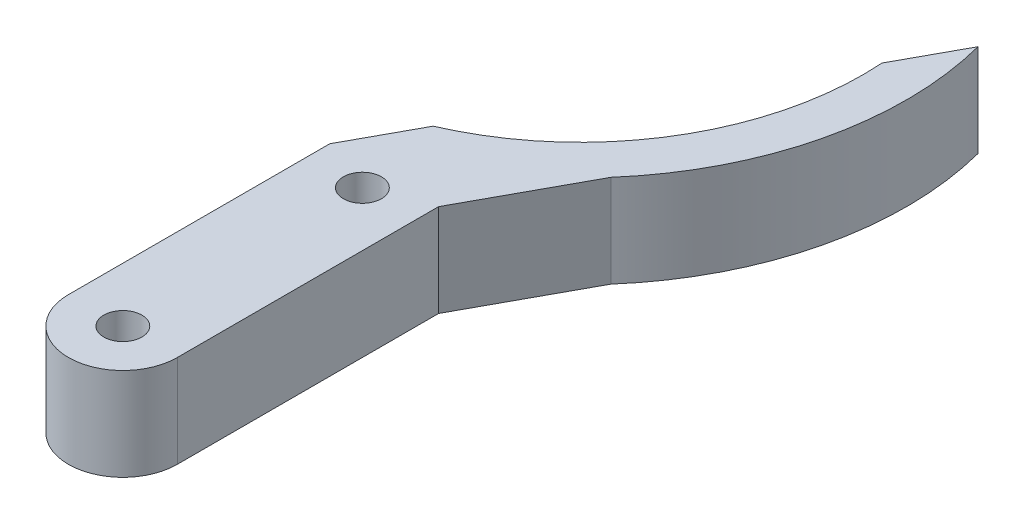
ISO-10303-21;
HEADER;
FILE_DESCRIPTION(('STEP AP214'),'2;1');
FILE_NAME('part.step','',(''),(''),'','','');
FILE_SCHEMA(('AUTOMOTIVE_DESIGN { 1 0 10303 214 1 1 1 1 }'));
ENDSEC;
DATA;
#1=APPLICATION_CONTEXT('core data for automotive mechanical design processes');
#2=APPLICATION_PROTOCOL_DEFINITION('international standard','automotive_design',2000,#1);
#3=PRODUCT_CONTEXT('',#1,'mechanical');
#4=PRODUCT('Part','Part','',(#3));
#5=PRODUCT_RELATED_PRODUCT_CATEGORY('part','',(#4));
#6=PRODUCT_DEFINITION_FORMATION('','',#4);
#7=PRODUCT_DEFINITION_CONTEXT('part definition',#1,'design');
#8=PRODUCT_DEFINITION('design','',#6,#7);
#9=PRODUCT_DEFINITION_SHAPE('','',#8);
#10=(LENGTH_UNIT() NAMED_UNIT(*) SI_UNIT(.MILLI.,.METRE.));
#11=(NAMED_UNIT(*) PLANE_ANGLE_UNIT() SI_UNIT($,.RADIAN.));
#12=(NAMED_UNIT(*) SI_UNIT($,.STERADIAN.) SOLID_ANGLE_UNIT());
#13=UNCERTAINTY_MEASURE_WITH_UNIT(LENGTH_MEASURE(1.E-05),#10,'distance_accuracy_value','');
#14=(GEOMETRIC_REPRESENTATION_CONTEXT(3) GLOBAL_UNCERTAINTY_ASSIGNED_CONTEXT((#13)) GLOBAL_UNIT_ASSIGNED_CONTEXT((#10,
#11,#12)) REPRESENTATION_CONTEXT('',''));
#15=CARTESIAN_POINT('',(0.,0.,0.));
#16=DIRECTION('',(0.,0.,1.));
#17=DIRECTION('',(1.,0.,0.));
#18=AXIS2_PLACEMENT_3D('',#15,#16,#17);
#19=CARTESIAN_POINT('',(0.,8.5,0.));
#20=DIRECTION('',(0.,-1.,0.));
#21=DIRECTION('',(0.,0.,-1.));
#22=AXIS2_PLACEMENT_3D('',#19,#20,#21);
#23=PLANE('',#22);
#24=CARTESIAN_POINT('',(0.,8.5,0.));
#25=DIRECTION('',(0.,1.,0.));
#26=DIRECTION('',(0.,0.,-1.));
#27=AXIS2_PLACEMENT_3D('',#24,#25,#26);
#28=CIRCLE('',#27,5.);
#29=CARTESIAN_POINT('',(-5.,8.5,0.));
#30=VERTEX_POINT('',#29);
#31=CARTESIAN_POINT('',(5.,8.5,0.));
#32=VERTEX_POINT('',#31);
#33=EDGE_CURVE('E146',#30,#32,#28,.T.);
#34=ORIENTED_EDGE('',*,*,#33,.T.);
#35=DIRECTION('',(0.,0.,-1.));
#36=VECTOR('',#35,1.);
#37=CARTESIAN_POINT('',(5.,8.5,0.));
#38=LINE('',#37,#36);
#39=CARTESIAN_POINT('',(5.,8.5,-24.));
#40=VERTEX_POINT('',#39);
#41=EDGE_CURVE('E94',#32,#40,#38,.T.);
#42=ORIENTED_EDGE('',*,*,#41,.T.);
#43=DIRECTION('',(0.478205527879426,0.,-0.8782479565052));
#44=VECTOR('',#43,1.);
#45=CARTESIAN_POINT('',(5.,8.5,-24.));
#46=LINE('',#45,#44);
#47=CARTESIAN_POINT('',(10.5800038599042,8.5,-34.2479513546895));
#48=VERTEX_POINT('',#47);
#49=EDGE_CURVE('E161',#40,#48,#46,.T.);
#50=ORIENTED_EDGE('',*,*,#49,.T.);
#51=CARTESIAN_POINT('',(-12.,8.5,-54.));
#52=DIRECTION('',(0.,1.,0.));
#53=DIRECTION('',(0.,0.,1.));
#54=AXIS2_PLACEMENT_3D('',#51,#52,#53);
#55=CIRCLE('',#54,30.);
#56=CARTESIAN_POINT('',(17.04979558469,8.5,-61.4906192325951));
#57=VERTEX_POINT('',#56);
#58=EDGE_CURVE('E174',#48,#57,#55,.T.);
#59=ORIENTED_EDGE('',*,*,#58,.T.);
#60=DIRECTION('',(-0.478205527879427,0.,0.8782479565052));
#61=VECTOR('',#60,1.);
#62=CARTESIAN_POINT('',(13.9391507928846,8.5,-55.7777671793552));
#63=LINE('',#62,#61);
#64=CARTESIAN_POINT('',(13.9391507928846,8.5,-55.7777671793552));
#65=VERTEX_POINT('',#64);
#66=EDGE_CURVE('E113',#57,#65,#63,.T.);
#67=ORIENTED_EDGE('',*,*,#66,.T.);
#68=CARTESIAN_POINT('',(-12.,8.5,-54.));
#69=DIRECTION('',(0.,-1.,0.));
#70=DIRECTION('',(0.,0.,1.));
#71=AXIS2_PLACEMENT_3D('',#68,#69,#70);
#72=CIRCLE('',#71,26.);
#73=CARTESIAN_POINT('',(-1.65256130484401,8.5,-30.1477356955364));
#74=VERTEX_POINT('',#73);
#75=EDGE_CURVE('E107',#65,#74,#72,.T.);
#76=ORIENTED_EDGE('',*,*,#75,.T.);
#77=DIRECTION('',(-0.478205527879427,0.,0.878247956505199));
#78=VECTOR('',#77,1.);
#79=CARTESIAN_POINT('',(-5.,8.5,-24.));
#80=LINE('',#79,#78);
#81=CARTESIAN_POINT('',(-5.,8.5,-24.));
#82=VERTEX_POINT('',#81);
#83=EDGE_CURVE('E111',#74,#82,#80,.T.);
#84=ORIENTED_EDGE('',*,*,#83,.T.);
#85=DIRECTION('',(0.,0.,1.));
#86=VECTOR('',#85,1.);
#87=CARTESIAN_POINT('',(-5.,8.5,0.));
#88=LINE('',#87,#86);
#89=EDGE_CURVE('E51',#82,#30,#88,.T.);
#90=ORIENTED_EDGE('',*,*,#89,.T.);
#91=EDGE_LOOP('',(#34,#42,#50,#59,#67,#76,#84,#90));
#92=FACE_BOUND('',#91,.T.);
#93=CARTESIAN_POINT('',(0.,8.5,0.));
#94=DIRECTION('',(0.,1.,0.));
#95=DIRECTION('',(0.,0.,1.));
#96=AXIS2_PLACEMENT_3D('',#93,#94,#95);
#97=CIRCLE('',#96,1.75);
#98=CARTESIAN_POINT('',(0.,8.5,1.75));
#99=VERTEX_POINT('',#98);
#100=EDGE_CURVE('E135',#99,#99,#97,.T.);
#101=ORIENTED_EDGE('',*,*,#100,.F.);
#102=EDGE_LOOP('',(#101));
#103=FACE_BOUND('',#102,.T.);
#104=CARTESIAN_POINT('',(0.,8.5,-22.));
#105=DIRECTION('',(0.,1.,0.));
#106=DIRECTION('',(0.,0.,1.));
#107=AXIS2_PLACEMENT_3D('',#104,#105,#106);
#108=CIRCLE('',#107,1.75);
#109=CARTESIAN_POINT('',(0.,8.5,-20.25));
#110=VERTEX_POINT('',#109);
#111=EDGE_CURVE('E183',#110,#110,#108,.T.);
#112=ORIENTED_EDGE('',*,*,#111,.F.);
#113=EDGE_LOOP('',(#112));
#114=FACE_BOUND('',#113,.T.);
#115=ADVANCED_FACE('F34',(#92,#103,#114),#23,.F.);
#116=CARTESIAN_POINT('',(0.,0.,0.));
#117=DIRECTION('',(0.,-1.,0.));
#118=DIRECTION('',(0.,0.,-1.));
#119=AXIS2_PLACEMENT_3D('',#116,#117,#118);
#120=PLANE('',#119);
#121=CARTESIAN_POINT('',(0.,0.,0.));
#122=DIRECTION('',(0.,1.,0.));
#123=DIRECTION('',(0.,0.,1.));
#124=AXIS2_PLACEMENT_3D('',#121,#122,#123);
#125=CIRCLE('',#124,1.75);
#126=CARTESIAN_POINT('',(0.,0.,1.75));
#127=VERTEX_POINT('',#126);
#128=EDGE_CURVE('E180',#127,#127,#125,.T.);
#129=ORIENTED_EDGE('',*,*,#128,.T.);
#130=EDGE_LOOP('',(#129));
#131=FACE_BOUND('',#130,.T.);
#132=CARTESIAN_POINT('',(0.,0.,0.));
#133=DIRECTION('',(0.,1.,0.));
#134=DIRECTION('',(0.,0.,-1.));
#135=AXIS2_PLACEMENT_3D('',#132,#133,#134);
#136=CIRCLE('',#135,5.);
#137=CARTESIAN_POINT('',(-5.,0.,0.));
#138=VERTEX_POINT('',#137);
#139=CARTESIAN_POINT('',(5.,0.,0.));
#140=VERTEX_POINT('',#139);
#141=EDGE_CURVE('E131',#138,#140,#136,.T.);
#142=ORIENTED_EDGE('',*,*,#141,.F.);
#143=DIRECTION('',(0.,0.,1.));
#144=VECTOR('',#143,1.);
#145=CARTESIAN_POINT('',(-5.,0.,0.));
#146=LINE('',#145,#144);
#147=CARTESIAN_POINT('',(-5.,0.,-24.));
#148=VERTEX_POINT('',#147);
#149=EDGE_CURVE('E86',#148,#138,#146,.T.);
#150=ORIENTED_EDGE('',*,*,#149,.F.);
#151=DIRECTION('',(-0.478205527879427,0.,0.878247956505199));
#152=VECTOR('',#151,1.);
#153=CARTESIAN_POINT('',(-5.,0.,-24.));
#154=LINE('',#153,#152);
#155=CARTESIAN_POINT('',(-1.65256130484401,0.,-30.1477356955364));
#156=VERTEX_POINT('',#155);
#157=EDGE_CURVE('E80',#156,#148,#154,.T.);
#158=ORIENTED_EDGE('',*,*,#157,.F.);
#159=CARTESIAN_POINT('',(-12.,0.,-54.));
#160=DIRECTION('',(0.,-1.,0.));
#161=DIRECTION('',(0.,0.,1.));
#162=AXIS2_PLACEMENT_3D('',#159,#160,#161);
#163=CIRCLE('',#162,26.);
#164=CARTESIAN_POINT('',(13.9391507928846,0.,-55.7777671793552));
#165=VERTEX_POINT('',#164);
#166=EDGE_CURVE('E121',#165,#156,#163,.T.);
#167=ORIENTED_EDGE('',*,*,#166,.F.);
#168=DIRECTION('',(-0.478205527879427,0.,0.8782479565052));
#169=VECTOR('',#168,1.);
#170=CARTESIAN_POINT('',(13.9391507928846,0.,-55.7777671793552));
#171=LINE('',#170,#169);
#172=CARTESIAN_POINT('',(17.04979558469,0.,-61.4906192325951));
#173=VERTEX_POINT('',#172);
#174=EDGE_CURVE('E141',#173,#165,#171,.T.);
#175=ORIENTED_EDGE('',*,*,#174,.F.);
#176=CARTESIAN_POINT('',(-12.,0.,-54.));
#177=DIRECTION('',(0.,1.,0.));
#178=DIRECTION('',(0.,0.,1.));
#179=AXIS2_PLACEMENT_3D('',#176,#177,#178);
#180=CIRCLE('',#179,30.);
#181=CARTESIAN_POINT('',(10.5800038599042,0.,-34.2479513546895));
#182=VERTEX_POINT('',#181);
#183=EDGE_CURVE('E139',#182,#173,#180,.T.);
#184=ORIENTED_EDGE('',*,*,#183,.F.);
#185=DIRECTION('',(0.478205527879426,0.,-0.8782479565052));
#186=VECTOR('',#185,1.);
#187=CARTESIAN_POINT('',(5.,0.,-24.));
#188=LINE('',#187,#186);
#189=CARTESIAN_POINT('',(5.,0.,-24.));
#190=VERTEX_POINT('',#189);
#191=EDGE_CURVE('E137',#190,#182,#188,.T.);
#192=ORIENTED_EDGE('',*,*,#191,.F.);
#193=DIRECTION('',(0.,0.,-1.));
#194=VECTOR('',#193,1.);
#195=CARTESIAN_POINT('',(5.,0.,0.));
#196=LINE('',#195,#194);
#197=EDGE_CURVE('E134',#140,#190,#196,.T.);
#198=ORIENTED_EDGE('',*,*,#197,.F.);
#199=EDGE_LOOP('',(#142,#150,#158,#167,#175,#184,#192,#198));
#200=FACE_BOUND('',#199,.T.);
#201=CARTESIAN_POINT('',(0.,0.,-22.));
#202=DIRECTION('',(0.,1.,0.));
#203=DIRECTION('',(0.,0.,1.));
#204=AXIS2_PLACEMENT_3D('',#201,#202,#203);
#205=CIRCLE('',#204,1.75);
#206=CARTESIAN_POINT('',(0.,0.,-20.25));
#207=VERTEX_POINT('',#206);
#208=EDGE_CURVE('E186',#207,#207,#205,.T.);
#209=ORIENTED_EDGE('',*,*,#208,.T.);
#210=EDGE_LOOP('',(#209));
#211=FACE_BOUND('',#210,.T.);
#212=ADVANCED_FACE('F165',(#131,#200,#211),#120,.T.);
#213=CARTESIAN_POINT('',(0.,8.5,0.));
#214=DIRECTION('',(0.,-1.,0.));
#215=DIRECTION('',(0.,0.,-1.));
#216=AXIS2_PLACEMENT_3D('',#213,#214,#215);
#217=CYLINDRICAL_SURFACE('',#216,5.);
#218=ORIENTED_EDGE('',*,*,#141,.T.);
#219=DIRECTION('',(0.,-1.,0.));
#220=VECTOR('',#219,1.);
#221=CARTESIAN_POINT('',(5.,8.5,0.));
#222=LINE('',#221,#220);
#223=EDGE_CURVE('E11',#32,#140,#222,.T.);
#224=ORIENTED_EDGE('',*,*,#223,.F.);
#225=ORIENTED_EDGE('',*,*,#33,.F.);
#226=DIRECTION('',(0.,-1.,0.));
#227=VECTOR('',#226,1.);
#228=CARTESIAN_POINT('',(-5.,8.5,0.));
#229=LINE('',#228,#227);
#230=EDGE_CURVE('E127',#30,#138,#229,.T.);
#231=ORIENTED_EDGE('',*,*,#230,.T.);
#232=EDGE_LOOP('',(#218,#224,#225,#231));
#233=FACE_BOUND('',#232,.T.);
#234=ADVANCED_FACE('F36',(#233),#217,.T.);
#235=CARTESIAN_POINT('',(5.,8.5,0.));
#236=DIRECTION('',(-1.,0.,0.));
#237=DIRECTION('',(0.,0.,1.));
#238=AXIS2_PLACEMENT_3D('',#235,#236,#237);
#239=PLANE('',#238);
#240=ORIENTED_EDGE('',*,*,#197,.T.);
#241=DIRECTION('',(0.,-1.,0.));
#242=VECTOR('',#241,1.);
#243=CARTESIAN_POINT('',(5.,8.5,-24.));
#244=LINE('',#243,#242);
#245=EDGE_CURVE('E43',#40,#190,#244,.T.);
#246=ORIENTED_EDGE('',*,*,#245,.F.);
#247=ORIENTED_EDGE('',*,*,#41,.F.);
#248=ORIENTED_EDGE('',*,*,#223,.T.);
#249=EDGE_LOOP('',(#240,#246,#247,#248));
#250=FACE_BOUND('',#249,.T.);
#251=ADVANCED_FACE('F218',(#250),#239,.F.);
#252=CARTESIAN_POINT('',(5.,8.5,-24.));
#253=DIRECTION('',(-0.8782479565052,0.,-0.478205527879426));
#254=DIRECTION('',(-0.478205527879426,0.,0.8782479565052));
#255=AXIS2_PLACEMENT_3D('',#252,#253,#254);
#256=PLANE('',#255);
#257=ORIENTED_EDGE('',*,*,#191,.T.);
#258=DIRECTION('',(0.,-1.,0.));
#259=VECTOR('',#258,1.);
#260=CARTESIAN_POINT('',(10.5800038599042,8.5,-34.2479513546895));
#261=LINE('',#260,#259);
#262=EDGE_CURVE('E153',#48,#182,#261,.T.);
#263=ORIENTED_EDGE('',*,*,#262,.F.);
#264=ORIENTED_EDGE('',*,*,#49,.F.);
#265=ORIENTED_EDGE('',*,*,#245,.T.);
#266=EDGE_LOOP('',(#257,#263,#264,#265));
#267=FACE_BOUND('',#266,.T.);
#268=ADVANCED_FACE('F159',(#267),#256,.F.);
#269=CARTESIAN_POINT('',(-12.,8.5,-54.));
#270=DIRECTION('',(0.,-1.,0.));
#271=DIRECTION('',(0.,0.,-1.));
#272=AXIS2_PLACEMENT_3D('',#269,#270,#271);
#273=CYLINDRICAL_SURFACE('',#272,30.);
#274=ORIENTED_EDGE('',*,*,#183,.T.);
#275=DIRECTION('',(0.,-1.,0.));
#276=VECTOR('',#275,1.);
#277=CARTESIAN_POINT('',(17.04979558469,8.5,-61.4906192325951));
#278=LINE('',#277,#276);
#279=EDGE_CURVE('E150',#57,#173,#278,.T.);
#280=ORIENTED_EDGE('',*,*,#279,.F.);
#281=ORIENTED_EDGE('',*,*,#58,.F.);
#282=ORIENTED_EDGE('',*,*,#262,.T.);
#283=EDGE_LOOP('',(#274,#280,#281,#282));
#284=FACE_BOUND('',#283,.T.);
#285=ADVANCED_FACE('F170',(#284),#273,.T.);
#286=CARTESIAN_POINT('',(13.9391507928846,8.5,-55.7777671793552));
#287=DIRECTION('',(0.8782479565052,0.,0.478205527879427));
#288=DIRECTION('',(0.478205527879427,0.,-0.8782479565052));
#289=AXIS2_PLACEMENT_3D('',#286,#287,#288);
#290=PLANE('',#289);
#291=ORIENTED_EDGE('',*,*,#174,.T.);
#292=DIRECTION('',(0.,-1.,0.));
#293=VECTOR('',#292,1.);
#294=CARTESIAN_POINT('',(13.9391507928846,8.5,-55.7777671793552));
#295=LINE('',#294,#293);
#296=EDGE_CURVE('E122',#65,#165,#295,.T.);
#297=ORIENTED_EDGE('',*,*,#296,.F.);
#298=ORIENTED_EDGE('',*,*,#66,.F.);
#299=ORIENTED_EDGE('',*,*,#279,.T.);
#300=EDGE_LOOP('',(#291,#297,#298,#299));
#301=FACE_BOUND('',#300,.T.);
#302=ADVANCED_FACE('F173',(#301),#290,.F.);
#303=CARTESIAN_POINT('',(-12.,8.5,-54.));
#304=DIRECTION('',(0.,-1.,0.));
#305=DIRECTION('',(0.,0.,-1.));
#306=AXIS2_PLACEMENT_3D('',#303,#304,#305);
#307=CYLINDRICAL_SURFACE('',#306,26.);
#308=ORIENTED_EDGE('',*,*,#166,.T.);
#309=DIRECTION('',(0.,-1.,0.));
#310=VECTOR('',#309,1.);
#311=CARTESIAN_POINT('',(-1.65256130484401,8.5,-30.1477356955364));
#312=LINE('',#311,#310);
#313=EDGE_CURVE('E118',#74,#156,#312,.T.);
#314=ORIENTED_EDGE('',*,*,#313,.F.);
#315=ORIENTED_EDGE('',*,*,#75,.F.);
#316=ORIENTED_EDGE('',*,*,#296,.T.);
#317=EDGE_LOOP('',(#308,#314,#315,#316));
#318=FACE_BOUND('',#317,.T.);
#319=ADVANCED_FACE('F119',(#318),#307,.F.);
#320=CARTESIAN_POINT('',(-5.,8.5,-24.));
#321=DIRECTION('',(0.8782479565052,0.,0.478205527879427));
#322=DIRECTION('',(0.478205527879427,0.,-0.8782479565052));
#323=AXIS2_PLACEMENT_3D('',#320,#321,#322);
#324=PLANE('',#323);
#325=ORIENTED_EDGE('',*,*,#157,.T.);
#326=DIRECTION('',(0.,-1.,0.));
#327=VECTOR('',#326,1.);
#328=CARTESIAN_POINT('',(-5.,8.5,-24.));
#329=LINE('',#328,#327);
#330=EDGE_CURVE('E123',#82,#148,#329,.T.);
#331=ORIENTED_EDGE('',*,*,#330,.F.);
#332=ORIENTED_EDGE('',*,*,#83,.F.);
#333=ORIENTED_EDGE('',*,*,#313,.T.);
#334=EDGE_LOOP('',(#325,#331,#332,#333));
#335=FACE_BOUND('',#334,.T.);
#336=ADVANCED_FACE('F125',(#335),#324,.F.);
#337=CARTESIAN_POINT('',(-5.,8.5,0.));
#338=DIRECTION('',(1.,0.,0.));
#339=DIRECTION('',(0.,0.,-1.));
#340=AXIS2_PLACEMENT_3D('',#337,#338,#339);
#341=PLANE('',#340);
#342=ORIENTED_EDGE('',*,*,#149,.T.);
#343=ORIENTED_EDGE('',*,*,#230,.F.);
#344=ORIENTED_EDGE('',*,*,#89,.F.);
#345=ORIENTED_EDGE('',*,*,#330,.T.);
#346=EDGE_LOOP('',(#342,#343,#344,#345));
#347=FACE_BOUND('',#346,.T.);
#348=ADVANCED_FACE('F206',(#347),#341,.F.);
#349=CARTESIAN_POINT('',(0.,8.5,0.));
#350=DIRECTION('',(0.,-1.,0.));
#351=DIRECTION('',(0.,0.,-1.));
#352=AXIS2_PLACEMENT_3D('',#349,#350,#351);
#353=CYLINDRICAL_SURFACE('',#352,1.75);
#354=ORIENTED_EDGE('',*,*,#100,.T.);
#355=EDGE_LOOP('',(#354));
#356=FACE_BOUND('',#355,.T.);
#357=ORIENTED_EDGE('',*,*,#128,.F.);
#358=EDGE_LOOP('',(#357));
#359=FACE_BOUND('',#358,.T.);
#360=ADVANCED_FACE('F203',(#356,#359),#353,.F.);
#361=CARTESIAN_POINT('',(0.,8.5,-22.));
#362=DIRECTION('',(0.,-1.,0.));
#363=DIRECTION('',(0.,0.,-1.));
#364=AXIS2_PLACEMENT_3D('',#361,#362,#363);
#365=CYLINDRICAL_SURFACE('',#364,1.75);
#366=ORIENTED_EDGE('',*,*,#111,.T.);
#367=EDGE_LOOP('',(#366));
#368=FACE_BOUND('',#367,.T.);
#369=ORIENTED_EDGE('',*,*,#208,.F.);
#370=EDGE_LOOP('',(#369));
#371=FACE_BOUND('',#370,.T.);
#372=ADVANCED_FACE('F192',(#368,#371),#365,.F.);
#373=CLOSED_SHELL('',(#115,#212,#234,#251,#268,#285,#302,#319,#336,#348,#360,#372));
#374=MANIFOLD_SOLID_BREP('B2',#373);
#375=ADVANCED_BREP_SHAPE_REPRESENTATION('',(#18,#374),#14);
#376=SHAPE_DEFINITION_REPRESENTATION(#9,#375);
ENDSEC;
END-ISO-10303-21;
